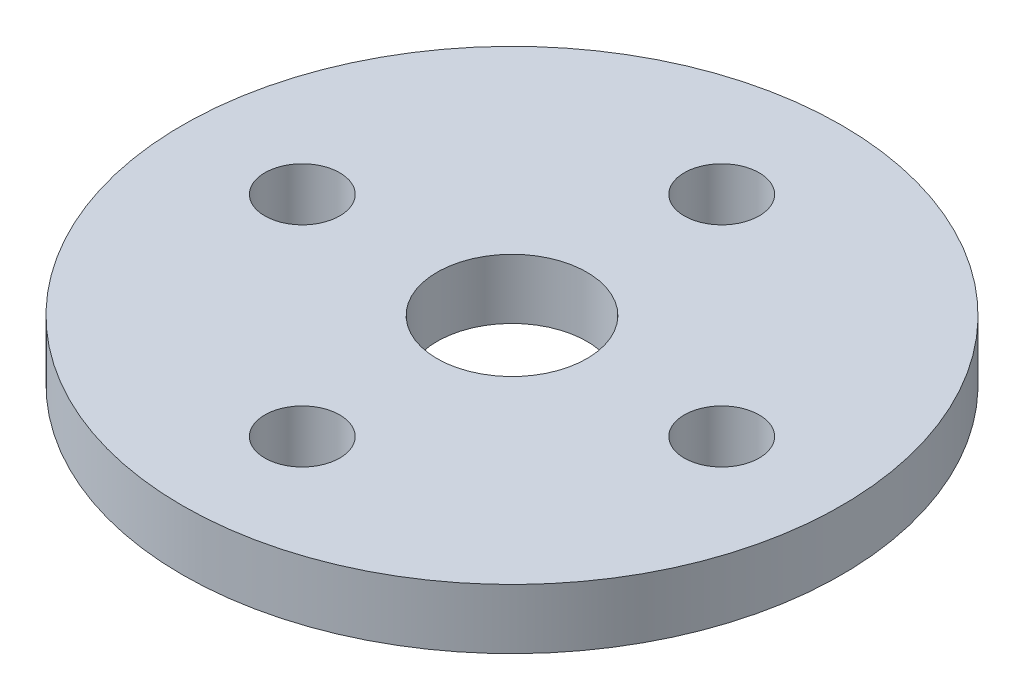
ISO-10303-21;
HEADER;
FILE_DESCRIPTION(('STEP AP214'),'2;1');
FILE_NAME('part.step','',(''),(''),'','','');
FILE_SCHEMA(('AUTOMOTIVE_DESIGN { 1 0 10303 214 1 1 1 1 }'));
ENDSEC;
DATA;
#1=APPLICATION_CONTEXT('core data for automotive mechanical design processes');
#2=APPLICATION_PROTOCOL_DEFINITION('international standard','automotive_design',2000,#1);
#3=PRODUCT_CONTEXT('',#1,'mechanical');
#4=PRODUCT('Part','Part','',(#3));
#5=PRODUCT_RELATED_PRODUCT_CATEGORY('part','',(#4));
#6=PRODUCT_DEFINITION_FORMATION('','',#4);
#7=PRODUCT_DEFINITION_CONTEXT('part definition',#1,'design');
#8=PRODUCT_DEFINITION('design','',#6,#7);
#9=PRODUCT_DEFINITION_SHAPE('','',#8);
#10=(LENGTH_UNIT() NAMED_UNIT(*) SI_UNIT(.MILLI.,.METRE.));
#11=(NAMED_UNIT(*) PLANE_ANGLE_UNIT() SI_UNIT($,.RADIAN.));
#12=(NAMED_UNIT(*) SI_UNIT($,.STERADIAN.) SOLID_ANGLE_UNIT());
#13=UNCERTAINTY_MEASURE_WITH_UNIT(LENGTH_MEASURE(1.E-05),#10,'distance_accuracy_value','');
#14=(GEOMETRIC_REPRESENTATION_CONTEXT(3) GLOBAL_UNCERTAINTY_ASSIGNED_CONTEXT((#13)) GLOBAL_UNIT_ASSIGNED_CONTEXT((#10,
#11,#12)) REPRESENTATION_CONTEXT('',''));
#15=CARTESIAN_POINT('',(0.,0.,0.));
#16=DIRECTION('',(0.,0.,1.));
#17=DIRECTION('',(1.,0.,0.));
#18=AXIS2_PLACEMENT_3D('',#15,#16,#17);
#19=CARTESIAN_POINT('',(0.,3.,0.));
#20=DIRECTION('',(0.,-1.,0.));
#21=DIRECTION('',(0.,0.,-1.));
#22=AXIS2_PLACEMENT_3D('',#19,#20,#21);
#23=CYLINDRICAL_SURFACE('',#22,11.);
#24=CARTESIAN_POINT('',(0.,0.,0.));
#25=DIRECTION('',(0.,1.,0.));
#26=DIRECTION('',(0.,0.,1.));
#27=AXIS2_PLACEMENT_3D('',#24,#25,#26);
#28=CIRCLE('',#27,11.);
#29=CARTESIAN_POINT('',(0.,0.,11.));
#30=VERTEX_POINT('',#29);
#31=EDGE_CURVE('E10',#30,#30,#28,.T.);
#32=ORIENTED_EDGE('',*,*,#31,.T.);
#33=EDGE_LOOP('',(#32));
#34=FACE_BOUND('',#33,.T.);
#35=CARTESIAN_POINT('',(0.,2.,0.));
#36=DIRECTION('',(0.,1.,0.));
#37=DIRECTION('',(0.,0.,1.));
#38=AXIS2_PLACEMENT_3D('',#35,#36,#37);
#39=CIRCLE('',#38,11.);
#40=CARTESIAN_POINT('',(0.,2.,11.));
#41=VERTEX_POINT('',#40);
#42=EDGE_CURVE('E87',#41,#41,#39,.T.);
#43=ORIENTED_EDGE('',*,*,#42,.F.);
#44=EDGE_LOOP('',(#43));
#45=FACE_BOUND('',#44,.T.);
#46=ADVANCED_FACE('F40',(#34,#45),#23,.T.);
#47=CARTESIAN_POINT('',(0.,3.,0.));
#48=DIRECTION('',(0.,-1.,0.));
#49=DIRECTION('',(0.,0.,-1.));
#50=AXIS2_PLACEMENT_3D('',#47,#48,#49);
#51=CYLINDRICAL_SURFACE('',#50,2.5);
#52=CARTESIAN_POINT('',(0.,0.,0.));
#53=DIRECTION('',(0.,1.,0.));
#54=DIRECTION('',(0.,0.,1.));
#55=AXIS2_PLACEMENT_3D('',#52,#53,#54);
#56=CIRCLE('',#55,2.5);
#57=CARTESIAN_POINT('',(0.,0.,2.5));
#58=VERTEX_POINT('',#57);
#59=EDGE_CURVE('E48',#58,#58,#56,.T.);
#60=ORIENTED_EDGE('',*,*,#59,.F.);
#61=EDGE_LOOP('',(#60));
#62=FACE_BOUND('',#61,.T.);
#63=CARTESIAN_POINT('',(0.,2.,0.));
#64=DIRECTION('',(0.,1.,0.));
#65=DIRECTION('',(0.,0.,1.));
#66=AXIS2_PLACEMENT_3D('',#63,#64,#65);
#67=CIRCLE('',#66,2.5);
#68=CARTESIAN_POINT('',(0.,2.,2.5));
#69=VERTEX_POINT('',#68);
#70=EDGE_CURVE('E71',#69,#69,#67,.T.);
#71=ORIENTED_EDGE('',*,*,#70,.T.);
#72=EDGE_LOOP('',(#71));
#73=FACE_BOUND('',#72,.T.);
#74=ADVANCED_FACE('F112',(#62,#73),#51,.F.);
#75=CARTESIAN_POINT('',(0.,3.,-7.));
#76=DIRECTION('',(0.,-1.,0.));
#77=DIRECTION('',(0.,0.,-1.));
#78=AXIS2_PLACEMENT_3D('',#75,#76,#77);
#79=CYLINDRICAL_SURFACE('',#78,1.25);
#80=CARTESIAN_POINT('',(0.,0.,-7.));
#81=DIRECTION('',(0.,1.,0.));
#82=DIRECTION('',(0.,0.,1.));
#83=AXIS2_PLACEMENT_3D('',#80,#81,#82);
#84=CIRCLE('',#83,1.25);
#85=CARTESIAN_POINT('',(0.,0.,-5.75));
#86=VERTEX_POINT('',#85);
#87=EDGE_CURVE('E53',#86,#86,#84,.T.);
#88=ORIENTED_EDGE('',*,*,#87,.F.);
#89=EDGE_LOOP('',(#88));
#90=FACE_BOUND('',#89,.T.);
#91=CARTESIAN_POINT('',(0.,2.,-7.));
#92=DIRECTION('',(0.,1.,0.));
#93=DIRECTION('',(0.,0.,1.));
#94=AXIS2_PLACEMENT_3D('',#91,#92,#93);
#95=CIRCLE('',#94,1.25);
#96=CARTESIAN_POINT('',(0.,2.,-5.75));
#97=VERTEX_POINT('',#96);
#98=EDGE_CURVE('E75',#97,#97,#95,.T.);
#99=ORIENTED_EDGE('',*,*,#98,.T.);
#100=EDGE_LOOP('',(#99));
#101=FACE_BOUND('',#100,.T.);
#102=ADVANCED_FACE('F117',(#90,#101),#79,.F.);
#103=CARTESIAN_POINT('',(7.,3.,0.));
#104=DIRECTION('',(0.,-1.,0.));
#105=DIRECTION('',(0.,0.,-1.));
#106=AXIS2_PLACEMENT_3D('',#103,#104,#105);
#107=CYLINDRICAL_SURFACE('',#106,1.25);
#108=CARTESIAN_POINT('',(7.,0.,0.));
#109=DIRECTION('',(0.,1.,0.));
#110=DIRECTION('',(0.,0.,1.));
#111=AXIS2_PLACEMENT_3D('',#108,#109,#110);
#112=CIRCLE('',#111,1.25);
#113=CARTESIAN_POINT('',(7.,0.,1.25));
#114=VERTEX_POINT('',#113);
#115=EDGE_CURVE('E59',#114,#114,#112,.T.);
#116=ORIENTED_EDGE('',*,*,#115,.F.);
#117=EDGE_LOOP('',(#116));
#118=FACE_BOUND('',#117,.T.);
#119=CARTESIAN_POINT('',(7.,2.,0.));
#120=DIRECTION('',(0.,1.,0.));
#121=DIRECTION('',(0.,0.,1.));
#122=AXIS2_PLACEMENT_3D('',#119,#120,#121);
#123=CIRCLE('',#122,1.25);
#124=CARTESIAN_POINT('',(7.,2.,1.25));
#125=VERTEX_POINT('',#124);
#126=EDGE_CURVE('E79',#125,#125,#123,.T.);
#127=ORIENTED_EDGE('',*,*,#126,.T.);
#128=EDGE_LOOP('',(#127));
#129=FACE_BOUND('',#128,.T.);
#130=ADVANCED_FACE('F124',(#118,#129),#107,.F.);
#131=CARTESIAN_POINT('',(0.,3.,7.));
#132=DIRECTION('',(0.,-1.,0.));
#133=DIRECTION('',(0.,0.,-1.));
#134=AXIS2_PLACEMENT_3D('',#131,#132,#133);
#135=CYLINDRICAL_SURFACE('',#134,1.25);
#136=CARTESIAN_POINT('',(0.,0.,7.));
#137=DIRECTION('',(0.,1.,0.));
#138=DIRECTION('',(0.,0.,1.));
#139=AXIS2_PLACEMENT_3D('',#136,#137,#138);
#140=CIRCLE('',#139,1.25);
#141=CARTESIAN_POINT('',(0.,0.,8.25));
#142=VERTEX_POINT('',#141);
#143=EDGE_CURVE('E63',#142,#142,#140,.T.);
#144=ORIENTED_EDGE('',*,*,#143,.F.);
#145=EDGE_LOOP('',(#144));
#146=FACE_BOUND('',#145,.T.);
#147=CARTESIAN_POINT('',(0.,2.,7.));
#148=DIRECTION('',(0.,1.,0.));
#149=DIRECTION('',(0.,0.,1.));
#150=AXIS2_PLACEMENT_3D('',#147,#148,#149);
#151=CIRCLE('',#150,1.25);
#152=CARTESIAN_POINT('',(0.,2.,8.25));
#153=VERTEX_POINT('',#152);
#154=EDGE_CURVE('E83',#153,#153,#151,.T.);
#155=ORIENTED_EDGE('',*,*,#154,.T.);
#156=EDGE_LOOP('',(#155));
#157=FACE_BOUND('',#156,.T.);
#158=ADVANCED_FACE('F132',(#146,#157),#135,.F.);
#159=CARTESIAN_POINT('',(-7.,3.,0.));
#160=DIRECTION('',(0.,-1.,0.));
#161=DIRECTION('',(0.,0.,-1.));
#162=AXIS2_PLACEMENT_3D('',#159,#160,#161);
#163=CYLINDRICAL_SURFACE('',#162,1.25);
#164=CARTESIAN_POINT('',(-7.,0.,0.));
#165=DIRECTION('',(0.,1.,0.));
#166=DIRECTION('',(0.,0.,1.));
#167=AXIS2_PLACEMENT_3D('',#164,#165,#166);
#168=CIRCLE('',#167,1.25);
#169=CARTESIAN_POINT('',(-7.,0.,1.25));
#170=VERTEX_POINT('',#169);
#171=EDGE_CURVE('E67',#170,#170,#168,.T.);
#172=ORIENTED_EDGE('',*,*,#171,.F.);
#173=EDGE_LOOP('',(#172));
#174=FACE_BOUND('',#173,.T.);
#175=CARTESIAN_POINT('',(-7.,2.,0.));
#176=DIRECTION('',(0.,1.,0.));
#177=DIRECTION('',(0.,0.,1.));
#178=AXIS2_PLACEMENT_3D('',#175,#176,#177);
#179=CIRCLE('',#178,1.25);
#180=CARTESIAN_POINT('',(-7.,2.,1.25));
#181=VERTEX_POINT('',#180);
#182=EDGE_CURVE('E43',#181,#181,#179,.T.);
#183=ORIENTED_EDGE('',*,*,#182,.T.);
#184=EDGE_LOOP('',(#183));
#185=FACE_BOUND('',#184,.T.);
#186=ADVANCED_FACE('F96',(#174,#185),#163,.F.);
#187=CARTESIAN_POINT('',(0.,0.,0.));
#188=DIRECTION('',(0.,1.,0.));
#189=DIRECTION('',(0.,0.,1.));
#190=AXIS2_PLACEMENT_3D('',#187,#188,#189);
#191=PLANE('',#190);
#192=ORIENTED_EDGE('',*,*,#31,.F.);
#193=EDGE_LOOP('',(#192));
#194=FACE_BOUND('',#193,.T.);
#195=ORIENTED_EDGE('',*,*,#59,.T.);
#196=EDGE_LOOP('',(#195));
#197=FACE_BOUND('',#196,.T.);
#198=ORIENTED_EDGE('',*,*,#87,.T.);
#199=EDGE_LOOP('',(#198));
#200=FACE_BOUND('',#199,.T.);
#201=ORIENTED_EDGE('',*,*,#115,.T.);
#202=EDGE_LOOP('',(#201));
#203=FACE_BOUND('',#202,.T.);
#204=ORIENTED_EDGE('',*,*,#143,.T.);
#205=EDGE_LOOP('',(#204));
#206=FACE_BOUND('',#205,.T.);
#207=ORIENTED_EDGE('',*,*,#171,.T.);
#208=EDGE_LOOP('',(#207));
#209=FACE_BOUND('',#208,.T.);
#210=ADVANCED_FACE('F100',(#194,#197,#200,#203,#206,#209),#191,.F.);
#211=CARTESIAN_POINT('',(0.,2.,0.));
#212=DIRECTION('',(0.,1.,0.));
#213=DIRECTION('',(0.,0.,1.));
#214=AXIS2_PLACEMENT_3D('',#211,#212,#213);
#215=PLANE('',#214);
#216=ORIENTED_EDGE('',*,*,#70,.F.);
#217=EDGE_LOOP('',(#216));
#218=FACE_BOUND('',#217,.T.);
#219=ORIENTED_EDGE('',*,*,#98,.F.);
#220=EDGE_LOOP('',(#219));
#221=FACE_BOUND('',#220,.T.);
#222=ORIENTED_EDGE('',*,*,#126,.F.);
#223=EDGE_LOOP('',(#222));
#224=FACE_BOUND('',#223,.T.);
#225=ORIENTED_EDGE('',*,*,#154,.F.);
#226=EDGE_LOOP('',(#225));
#227=FACE_BOUND('',#226,.T.);
#228=ORIENTED_EDGE('',*,*,#182,.F.);
#229=EDGE_LOOP('',(#228));
#230=FACE_BOUND('',#229,.T.);
#231=ORIENTED_EDGE('',*,*,#42,.T.);
#232=EDGE_LOOP('',(#231));
#233=FACE_BOUND('',#232,.T.);
#234=ADVANCED_FACE('F98',(#218,#221,#224,#227,#230,#233),#215,.T.);
#235=CLOSED_SHELL('',(#46,#74,#102,#130,#158,#186,#210,#234));
#236=MANIFOLD_SOLID_BREP('B2',#235);
#237=ADVANCED_BREP_SHAPE_REPRESENTATION('',(#18,#236),#14);
#238=SHAPE_DEFINITION_REPRESENTATION(#9,#237);
ENDSEC;
END-ISO-10303-21;
